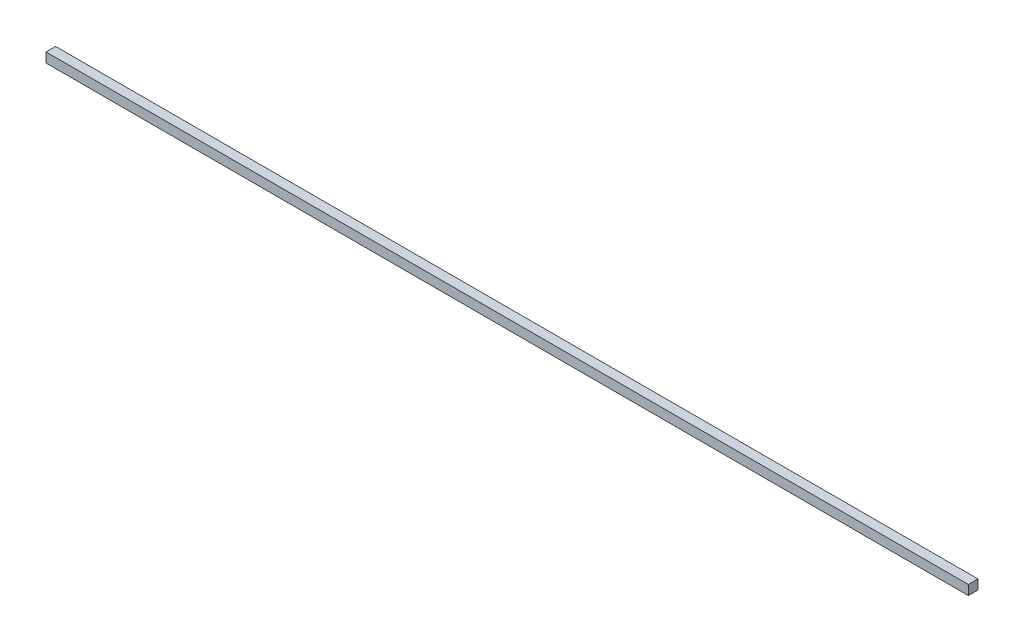
ISO-10303-21;
HEADER;
FILE_DESCRIPTION(('STEP AP214'),'2;1');
FILE_NAME('part.step','',(''),(''),'','','');
FILE_SCHEMA(('AUTOMOTIVE_DESIGN { 1 0 10303 214 1 1 1 1 }'));
ENDSEC;
DATA;
#1=APPLICATION_CONTEXT('core data for automotive mechanical design processes');
#2=APPLICATION_PROTOCOL_DEFINITION('international standard','automotive_design',2000,#1);
#3=PRODUCT_CONTEXT('',#1,'mechanical');
#4=PRODUCT('Part','Part','',(#3));
#5=PRODUCT_RELATED_PRODUCT_CATEGORY('part','',(#4));
#6=PRODUCT_DEFINITION_FORMATION('','',#4);
#7=PRODUCT_DEFINITION_CONTEXT('part definition',#1,'design');
#8=PRODUCT_DEFINITION('design','',#6,#7);
#9=PRODUCT_DEFINITION_SHAPE('','',#8);
#10=(LENGTH_UNIT() NAMED_UNIT(*) SI_UNIT(.MILLI.,.METRE.));
#11=(NAMED_UNIT(*) PLANE_ANGLE_UNIT() SI_UNIT($,.RADIAN.));
#12=(NAMED_UNIT(*) SI_UNIT($,.STERADIAN.) SOLID_ANGLE_UNIT());
#13=UNCERTAINTY_MEASURE_WITH_UNIT(LENGTH_MEASURE(1.E-05),#10,'distance_accuracy_value','');
#14=(GEOMETRIC_REPRESENTATION_CONTEXT(3) GLOBAL_UNCERTAINTY_ASSIGNED_CONTEXT((#13)) GLOBAL_UNIT_ASSIGNED_CONTEXT((#10,
#11,#12)) REPRESENTATION_CONTEXT('',''));
#15=CARTESIAN_POINT('',(0.,0.,0.));
#16=DIRECTION('',(0.,0.,1.));
#17=DIRECTION('',(1.,0.,0.));
#18=AXIS2_PLACEMENT_3D('',#15,#16,#17);
#19=CARTESIAN_POINT('',(-914.4,-9.525,0.));
#20=DIRECTION('',(0.,-1.,0.));
#21=DIRECTION('',(0.,0.,-1.));
#22=AXIS2_PLACEMENT_3D('',#19,#20,#21);
#23=PLANE('',#22);
#24=DIRECTION('',(0.,0.,-1.));
#25=VECTOR('',#24,1.);
#26=CARTESIAN_POINT('',(914.4,-9.525,0.));
#27=LINE('',#26,#25);
#28=CARTESIAN_POINT('',(914.4,-9.525,0.));
#29=VERTEX_POINT('',#28);
#30=CARTESIAN_POINT('',(914.4,-9.525,-19.05));
#31=VERTEX_POINT('',#30);
#32=EDGE_CURVE('E82',#29,#31,#27,.T.);
#33=ORIENTED_EDGE('',*,*,#32,.F.);
#34=DIRECTION('',(1.,0.,0.));
#35=VECTOR('',#34,1.);
#36=CARTESIAN_POINT('',(-914.4,-9.525,0.));
#37=LINE('',#36,#35);
#38=CARTESIAN_POINT('',(-914.4,-9.525,0.));
#39=VERTEX_POINT('',#38);
#40=EDGE_CURVE('E87',#39,#29,#37,.T.);
#41=ORIENTED_EDGE('',*,*,#40,.F.);
#42=DIRECTION('',(0.,0.,-1.));
#43=VECTOR('',#42,1.);
#44=CARTESIAN_POINT('',(-914.4,-9.525,0.));
#45=LINE('',#44,#43);
#46=CARTESIAN_POINT('',(-914.4,-9.525,-19.05));
#47=VERTEX_POINT('',#46);
#48=EDGE_CURVE('E73',#39,#47,#45,.T.);
#49=ORIENTED_EDGE('',*,*,#48,.T.);
#50=DIRECTION('',(-1.,0.,0.));
#51=VECTOR('',#50,1.);
#52=CARTESIAN_POINT('',(-914.4,-9.525,-19.05));
#53=LINE('',#52,#51);
#54=EDGE_CURVE('E38',#31,#47,#53,.T.);
#55=ORIENTED_EDGE('',*,*,#54,.F.);
#56=EDGE_LOOP('',(#33,#41,#49,#55));
#57=FACE_BOUND('',#56,.T.);
#58=ADVANCED_FACE('F35',(#57),#23,.T.);
#59=CARTESIAN_POINT('',(-914.4,0.,0.));
#60=DIRECTION('',(1.,0.,0.));
#61=DIRECTION('',(0.,0.,-1.));
#62=AXIS2_PLACEMENT_3D('',#59,#60,#61);
#63=PLANE('',#62);
#64=DIRECTION('',(0.,1.,0.));
#65=VECTOR('',#64,1.);
#66=CARTESIAN_POINT('',(-914.4,6.35,-19.05));
#67=LINE('',#66,#65);
#68=CARTESIAN_POINT('',(-914.4,9.525,-19.05));
#69=VERTEX_POINT('',#68);
#70=EDGE_CURVE('E76',#47,#69,#67,.T.);
#71=ORIENTED_EDGE('',*,*,#70,.F.);
#72=ORIENTED_EDGE('',*,*,#48,.F.);
#73=DIRECTION('',(0.,1.,0.));
#74=VECTOR('',#73,1.);
#75=CARTESIAN_POINT('',(-914.4,9.525,0.));
#76=LINE('',#75,#74);
#77=CARTESIAN_POINT('',(-914.4,9.525,0.));
#78=VERTEX_POINT('',#77);
#79=EDGE_CURVE('E89',#78,#39,#76,.F.);
#80=ORIENTED_EDGE('',*,*,#79,.F.);
#81=DIRECTION('',(0.,0.,1.));
#82=VECTOR('',#81,1.);
#83=CARTESIAN_POINT('',(-914.4,9.525,-19.05));
#84=LINE('',#83,#82);
#85=EDGE_CURVE('E79',#69,#78,#84,.T.);
#86=ORIENTED_EDGE('',*,*,#85,.F.);
#87=EDGE_LOOP('',(#71,#72,#80,#86));
#88=FACE_BOUND('',#87,.T.);
#89=ADVANCED_FACE('F77',(#88),#63,.F.);
#90=CARTESIAN_POINT('',(-914.4,9.525,0.));
#91=DIRECTION('',(0.,0.,1.));
#92=DIRECTION('',(1.,0.,0.));
#93=AXIS2_PLACEMENT_3D('',#90,#91,#92);
#94=PLANE('',#93);
#95=DIRECTION('',(0.,1.,0.));
#96=VECTOR('',#95,1.);
#97=CARTESIAN_POINT('',(914.4,0.,0.));
#98=LINE('',#97,#96);
#99=CARTESIAN_POINT('',(914.4,9.525,0.));
#100=VERTEX_POINT('',#99);
#101=EDGE_CURVE('E98',#100,#29,#98,.F.);
#102=ORIENTED_EDGE('',*,*,#101,.F.);
#103=DIRECTION('',(1.,0.,0.));
#104=VECTOR('',#103,1.);
#105=CARTESIAN_POINT('',(-914.4,9.525,0.));
#106=LINE('',#105,#104);
#107=EDGE_CURVE('E93',#78,#100,#106,.T.);
#108=ORIENTED_EDGE('',*,*,#107,.F.);
#109=ORIENTED_EDGE('',*,*,#79,.T.);
#110=ORIENTED_EDGE('',*,*,#40,.T.);
#111=EDGE_LOOP('',(#102,#108,#109,#110));
#112=FACE_BOUND('',#111,.T.);
#113=ADVANCED_FACE('F104',(#112),#94,.T.);
#114=CARTESIAN_POINT('',(914.4,0.,0.));
#115=DIRECTION('',(1.,0.,0.));
#116=DIRECTION('',(0.,0.,-1.));
#117=AXIS2_PLACEMENT_3D('',#114,#115,#116);
#118=PLANE('',#117);
#119=ORIENTED_EDGE('',*,*,#32,.T.);
#120=DIRECTION('',(0.,1.,0.));
#121=VECTOR('',#120,1.);
#122=CARTESIAN_POINT('',(914.4,6.35,-19.05));
#123=LINE('',#122,#121);
#124=CARTESIAN_POINT('',(914.4,9.525,-19.05));
#125=VERTEX_POINT('',#124);
#126=EDGE_CURVE('E53',#125,#31,#123,.F.);
#127=ORIENTED_EDGE('',*,*,#126,.F.);
#128=DIRECTION('',(0.,0.,1.));
#129=VECTOR('',#128,1.);
#130=CARTESIAN_POINT('',(914.4,9.525,-19.05));
#131=LINE('',#130,#129);
#132=EDGE_CURVE('E44',#100,#125,#131,.F.);
#133=ORIENTED_EDGE('',*,*,#132,.F.);
#134=ORIENTED_EDGE('',*,*,#101,.T.);
#135=EDGE_LOOP('',(#119,#127,#133,#134));
#136=FACE_BOUND('',#135,.T.);
#137=ADVANCED_FACE('F109',(#136),#118,.T.);
#138=CARTESIAN_POINT('',(-914.4,6.35,-19.05));
#139=DIRECTION('',(0.,0.,-1.));
#140=DIRECTION('',(-1.,0.,0.));
#141=AXIS2_PLACEMENT_3D('',#138,#139,#140);
#142=PLANE('',#141);
#143=ORIENTED_EDGE('',*,*,#126,.T.);
#144=ORIENTED_EDGE('',*,*,#54,.T.);
#145=ORIENTED_EDGE('',*,*,#70,.T.);
#146=DIRECTION('',(1.,0.,0.));
#147=VECTOR('',#146,1.);
#148=CARTESIAN_POINT('',(-914.4,9.525,-19.05));
#149=LINE('',#148,#147);
#150=EDGE_CURVE('E11',#125,#69,#149,.F.);
#151=ORIENTED_EDGE('',*,*,#150,.F.);
#152=EDGE_LOOP('',(#143,#144,#145,#151));
#153=FACE_BOUND('',#152,.T.);
#154=ADVANCED_FACE('F90',(#153),#142,.T.);
#155=CARTESIAN_POINT('',(-914.4,9.525,-19.05));
#156=DIRECTION('',(0.,1.,0.));
#157=DIRECTION('',(0.,0.,1.));
#158=AXIS2_PLACEMENT_3D('',#155,#156,#157);
#159=PLANE('',#158);
#160=ORIENTED_EDGE('',*,*,#132,.T.);
#161=ORIENTED_EDGE('',*,*,#150,.T.);
#162=ORIENTED_EDGE('',*,*,#85,.T.);
#163=ORIENTED_EDGE('',*,*,#107,.T.);
#164=EDGE_LOOP('',(#160,#161,#162,#163));
#165=FACE_BOUND('',#164,.T.);
#166=ADVANCED_FACE('F107',(#165),#159,.T.);
#167=CLOSED_SHELL('',(#58,#89,#113,#137,#154,#166));
#168=MANIFOLD_SOLID_BREP('B2',#167);
#169=ADVANCED_BREP_SHAPE_REPRESENTATION('',(#18,#168),#14);
#170=SHAPE_DEFINITION_REPRESENTATION(#9,#169);
ENDSEC;
END-ISO-10303-21;
